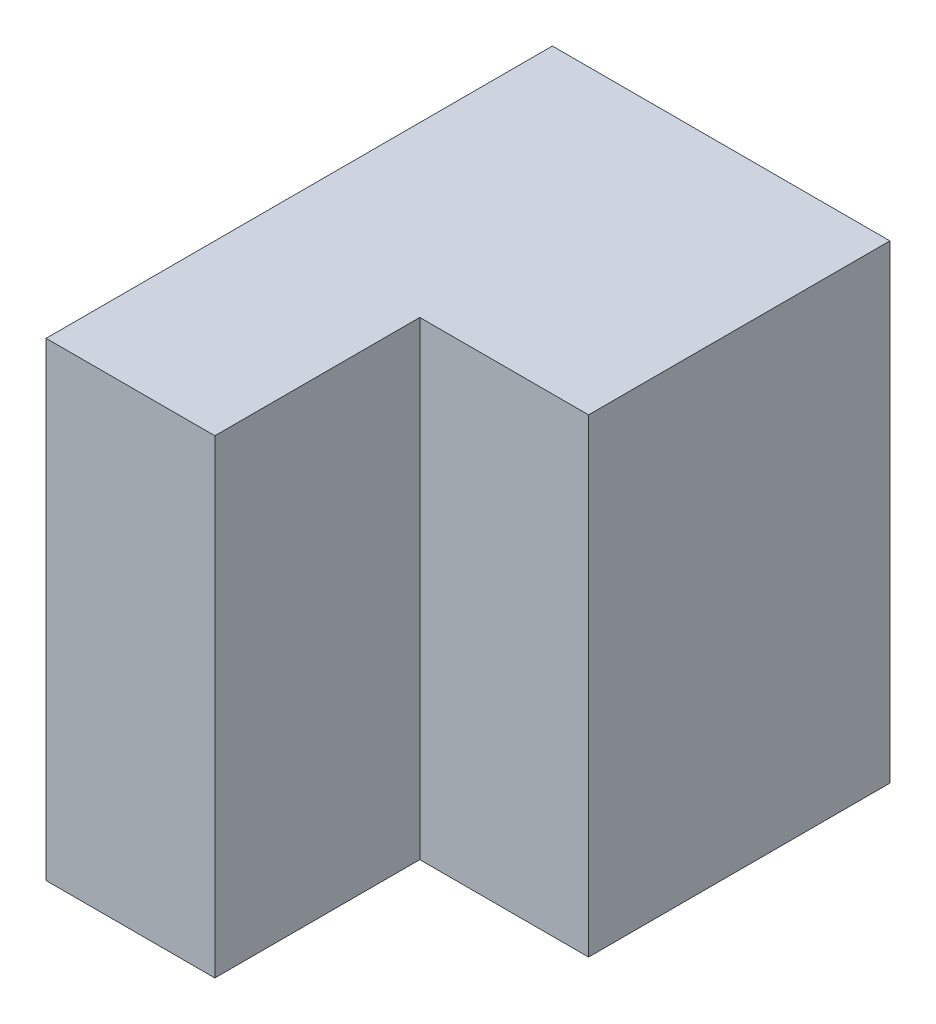
ISO-10303-21;
HEADER;
FILE_DESCRIPTION(('STEP AP214'),'2;1');
FILE_NAME('part.step','',(''),(''),'','','');
FILE_SCHEMA(('AUTOMOTIVE_DESIGN { 1 0 10303 214 1 1 1 1 }'));
ENDSEC;
DATA;
#1=APPLICATION_CONTEXT('core data for automotive mechanical design processes');
#2=APPLICATION_PROTOCOL_DEFINITION('international standard','automotive_design',2000,#1);
#3=PRODUCT_CONTEXT('',#1,'mechanical');
#4=PRODUCT('Part','Part','',(#3));
#5=PRODUCT_RELATED_PRODUCT_CATEGORY('part','',(#4));
#6=PRODUCT_DEFINITION_FORMATION('','',#4);
#7=PRODUCT_DEFINITION_CONTEXT('part definition',#1,'design');
#8=PRODUCT_DEFINITION('design','',#6,#7);
#9=PRODUCT_DEFINITION_SHAPE('','',#8);
#10=(LENGTH_UNIT() NAMED_UNIT(*) SI_UNIT(.MILLI.,.METRE.));
#11=(NAMED_UNIT(*) PLANE_ANGLE_UNIT() SI_UNIT($,.RADIAN.));
#12=(NAMED_UNIT(*) SI_UNIT($,.STERADIAN.) SOLID_ANGLE_UNIT());
#13=UNCERTAINTY_MEASURE_WITH_UNIT(LENGTH_MEASURE(1.E-05),#10,'distance_accuracy_value','');
#14=(GEOMETRIC_REPRESENTATION_CONTEXT(3) GLOBAL_UNCERTAINTY_ASSIGNED_CONTEXT((#13)) GLOBAL_UNIT_ASSIGNED_CONTEXT((#10,
#11,#12)) REPRESENTATION_CONTEXT('',''));
#15=CARTESIAN_POINT('',(0.,0.,0.));
#16=DIRECTION('',(0.,0.,1.));
#17=DIRECTION('',(1.,0.,0.));
#18=AXIS2_PLACEMENT_3D('',#15,#16,#17);
#19=CARTESIAN_POINT('',(10.,0.,0.));
#20=DIRECTION('',(0.,0.,-1.));
#21=DIRECTION('',(-1.,0.,0.));
#22=AXIS2_PLACEMENT_3D('',#19,#20,#21);
#23=PLANE('',#22);
#24=DIRECTION('',(0.,-1.,0.));
#25=VECTOR('',#24,1.);
#26=CARTESIAN_POINT('',(5.,13.9128959378809,0.));
#27=LINE('',#26,#25);
#28=CARTESIAN_POINT('',(5.,13.9128959378809,0.));
#29=VERTEX_POINT('',#28);
#30=CARTESIAN_POINT('',(5.,0.,0.));
#31=VERTEX_POINT('',#30);
#32=EDGE_CURVE('E87',#29,#31,#27,.T.);
#33=ORIENTED_EDGE('',*,*,#32,.F.);
#34=DIRECTION('',(-1.,0.,0.));
#35=VECTOR('',#34,1.);
#36=CARTESIAN_POINT('',(10.,13.9128959378809,0.));
#37=LINE('',#36,#35);
#38=CARTESIAN_POINT('',(0.,13.9128959378809,0.));
#39=VERTEX_POINT('',#38);
#40=EDGE_CURVE('E81',#29,#39,#37,.T.);
#41=ORIENTED_EDGE('',*,*,#40,.T.);
#42=DIRECTION('',(0.,-1.,0.));
#43=VECTOR('',#42,1.);
#44=CARTESIAN_POINT('',(0.,0.,0.));
#45=LINE('',#44,#43);
#46=CARTESIAN_POINT('',(0.,0.,0.));
#47=VERTEX_POINT('',#46);
#48=EDGE_CURVE('E85',#39,#47,#45,.T.);
#49=ORIENTED_EDGE('',*,*,#48,.T.);
#50=DIRECTION('',(-1.,0.,0.));
#51=VECTOR('',#50,1.);
#52=CARTESIAN_POINT('',(10.,0.,0.));
#53=LINE('',#52,#51);
#54=EDGE_CURVE('E11',#31,#47,#53,.T.);
#55=ORIENTED_EDGE('',*,*,#54,.F.);
#56=EDGE_LOOP('',(#33,#41,#49,#55));
#57=FACE_BOUND('',#56,.T.);
#58=ADVANCED_FACE('F39',(#57),#23,.F.);
#59=CARTESIAN_POINT('',(10.,0.,0.));
#60=DIRECTION('',(0.,1.,0.));
#61=DIRECTION('',(0.,0.,1.));
#62=AXIS2_PLACEMENT_3D('',#59,#60,#61);
#63=PLANE('',#62);
#64=DIRECTION('',(0.,0.,-1.));
#65=VECTOR('',#64,1.);
#66=CARTESIAN_POINT('',(10.,0.,0.));
#67=LINE('',#66,#65);
#68=CARTESIAN_POINT('',(10.,0.,-6.07163105874278));
#69=VERTEX_POINT('',#68);
#70=CARTESIAN_POINT('',(10.,0.,-15.));
#71=VERTEX_POINT('',#70);
#72=EDGE_CURVE('E100',#69,#71,#67,.T.);
#73=ORIENTED_EDGE('',*,*,#72,.F.);
#74=DIRECTION('',(1.,0.,0.));
#75=VECTOR('',#74,1.);
#76=CARTESIAN_POINT('',(5.,0.,-6.07163105874278));
#77=LINE('',#76,#75);
#78=CARTESIAN_POINT('',(5.,0.,-6.07163105874278));
#79=VERTEX_POINT('',#78);
#80=EDGE_CURVE('E53',#79,#69,#77,.T.);
#81=ORIENTED_EDGE('',*,*,#80,.F.);
#82=DIRECTION('',(0.,0.,-1.));
#83=VECTOR('',#82,1.);
#84=CARTESIAN_POINT('',(5.,0.,0.));
#85=LINE('',#84,#83);
#86=EDGE_CURVE('E125',#31,#79,#85,.T.);
#87=ORIENTED_EDGE('',*,*,#86,.F.);
#88=ORIENTED_EDGE('',*,*,#54,.T.);
#89=DIRECTION('',(0.,0.,-1.));
#90=VECTOR('',#89,1.);
#91=CARTESIAN_POINT('',(0.,0.,0.));
#92=LINE('',#91,#90);
#93=CARTESIAN_POINT('',(0.,0.,-15.));
#94=VERTEX_POINT('',#93);
#95=EDGE_CURVE('E105',#47,#94,#92,.T.);
#96=ORIENTED_EDGE('',*,*,#95,.T.);
#97=DIRECTION('',(-1.,0.,0.));
#98=VECTOR('',#97,1.);
#99=CARTESIAN_POINT('',(10.,0.,-15.));
#100=LINE('',#99,#98);
#101=EDGE_CURVE('E46',#71,#94,#100,.T.);
#102=ORIENTED_EDGE('',*,*,#101,.F.);
#103=EDGE_LOOP('',(#73,#81,#87,#88,#96,#102));
#104=FACE_BOUND('',#103,.T.);
#105=ADVANCED_FACE('F121',(#104),#63,.F.);
#106=CARTESIAN_POINT('',(10.,0.,-15.));
#107=DIRECTION('',(0.,0.,1.));
#108=DIRECTION('',(1.,0.,0.));
#109=AXIS2_PLACEMENT_3D('',#106,#107,#108);
#110=PLANE('',#109);
#111=DIRECTION('',(0.,1.,0.));
#112=VECTOR('',#111,1.);
#113=CARTESIAN_POINT('',(0.,0.,-15.));
#114=LINE('',#113,#112);
#115=CARTESIAN_POINT('',(0.,13.9128959378809,-15.));
#116=VERTEX_POINT('',#115);
#117=EDGE_CURVE('E101',#94,#116,#114,.T.);
#118=ORIENTED_EDGE('',*,*,#117,.T.);
#119=DIRECTION('',(-1.,0.,0.));
#120=VECTOR('',#119,1.);
#121=CARTESIAN_POINT('',(10.,13.9128959378809,-15.));
#122=LINE('',#121,#120);
#123=CARTESIAN_POINT('',(10.,13.9128959378809,-15.));
#124=VERTEX_POINT('',#123);
#125=EDGE_CURVE('E90',#124,#116,#122,.T.);
#126=ORIENTED_EDGE('',*,*,#125,.F.);
#127=DIRECTION('',(0.,1.,0.));
#128=VECTOR('',#127,1.);
#129=CARTESIAN_POINT('',(10.,0.,-15.));
#130=LINE('',#129,#128);
#131=EDGE_CURVE('E62',#71,#124,#130,.T.);
#132=ORIENTED_EDGE('',*,*,#131,.F.);
#133=ORIENTED_EDGE('',*,*,#101,.T.);
#134=EDGE_LOOP('',(#118,#126,#132,#133));
#135=FACE_BOUND('',#134,.T.);
#136=ADVANCED_FACE('F118',(#135),#110,.F.);
#137=CARTESIAN_POINT('',(10.,13.9128959378809,0.));
#138=DIRECTION('',(0.,-1.,0.));
#139=DIRECTION('',(0.,0.,-1.));
#140=AXIS2_PLACEMENT_3D('',#137,#138,#139);
#141=PLANE('',#140);
#142=DIRECTION('',(0.,0.,1.));
#143=VECTOR('',#142,1.);
#144=CARTESIAN_POINT('',(5.,13.9128959378809,0.));
#145=LINE('',#144,#143);
#146=CARTESIAN_POINT('',(5.,13.9128959378809,-6.07163105874278));
#147=VERTEX_POINT('',#146);
#148=EDGE_CURVE('E137',#147,#29,#145,.T.);
#149=ORIENTED_EDGE('',*,*,#148,.F.);
#150=DIRECTION('',(1.,0.,0.));
#151=VECTOR('',#150,1.);
#152=CARTESIAN_POINT('',(5.,13.9128959378809,-6.07163105874278));
#153=LINE('',#152,#151);
#154=CARTESIAN_POINT('',(10.,13.9128959378809,-6.07163105874278));
#155=VERTEX_POINT('',#154);
#156=EDGE_CURVE('E106',#147,#155,#153,.T.);
#157=ORIENTED_EDGE('',*,*,#156,.T.);
#158=DIRECTION('',(0.,0.,1.));
#159=VECTOR('',#158,1.);
#160=CARTESIAN_POINT('',(10.,13.9128959378809,0.));
#161=LINE('',#160,#159);
#162=EDGE_CURVE('E91',#124,#155,#161,.T.);
#163=ORIENTED_EDGE('',*,*,#162,.F.);
#164=ORIENTED_EDGE('',*,*,#125,.T.);
#165=DIRECTION('',(0.,0.,1.));
#166=VECTOR('',#165,1.);
#167=CARTESIAN_POINT('',(0.,13.9128959378809,0.));
#168=LINE('',#167,#166);
#169=EDGE_CURVE('E95',#116,#39,#168,.T.);
#170=ORIENTED_EDGE('',*,*,#169,.T.);
#171=ORIENTED_EDGE('',*,*,#40,.F.);
#172=EDGE_LOOP('',(#149,#157,#163,#164,#170,#171));
#173=FACE_BOUND('',#172,.T.);
#174=ADVANCED_FACE('F96',(#173),#141,.F.);
#175=CARTESIAN_POINT('',(10.,0.,0.));
#176=DIRECTION('',(-1.,0.,0.));
#177=DIRECTION('',(0.,0.,1.));
#178=AXIS2_PLACEMENT_3D('',#175,#176,#177);
#179=PLANE('',#178);
#180=ORIENTED_EDGE('',*,*,#162,.T.);
#181=DIRECTION('',(0.,1.,0.));
#182=VECTOR('',#181,1.);
#183=CARTESIAN_POINT('',(10.,13.9128959378809,-6.07163105874278));
#184=LINE('',#183,#182);
#185=EDGE_CURVE('E145',#69,#155,#184,.T.);
#186=ORIENTED_EDGE('',*,*,#185,.F.);
#187=ORIENTED_EDGE('',*,*,#72,.T.);
#188=ORIENTED_EDGE('',*,*,#131,.T.);
#189=EDGE_LOOP('',(#180,#186,#187,#188));
#190=FACE_BOUND('',#189,.T.);
#191=ADVANCED_FACE('F147',(#190),#179,.F.);
#192=CARTESIAN_POINT('',(0.,0.,0.));
#193=DIRECTION('',(-1.,0.,0.));
#194=DIRECTION('',(0.,0.,1.));
#195=AXIS2_PLACEMENT_3D('',#192,#193,#194);
#196=PLANE('',#195);
#197=ORIENTED_EDGE('',*,*,#48,.F.);
#198=ORIENTED_EDGE('',*,*,#169,.F.);
#199=ORIENTED_EDGE('',*,*,#117,.F.);
#200=ORIENTED_EDGE('',*,*,#95,.F.);
#201=EDGE_LOOP('',(#197,#198,#199,#200));
#202=FACE_BOUND('',#201,.T.);
#203=ADVANCED_FACE('F104',(#202),#196,.T.);
#204=CARTESIAN_POINT('',(5.,13.9128959378809,-6.07163105874278));
#205=DIRECTION('',(0.,0.,-1.));
#206=DIRECTION('',(0.,1.,0.));
#207=AXIS2_PLACEMENT_3D('',#204,#205,#206);
#208=PLANE('',#207);
#209=ORIENTED_EDGE('',*,*,#185,.T.);
#210=ORIENTED_EDGE('',*,*,#156,.F.);
#211=DIRECTION('',(0.,1.,0.));
#212=VECTOR('',#211,1.);
#213=CARTESIAN_POINT('',(5.,13.9128959378809,-6.07163105874278));
#214=LINE('',#213,#212);
#215=EDGE_CURVE('E139',#79,#147,#214,.T.);
#216=ORIENTED_EDGE('',*,*,#215,.F.);
#217=ORIENTED_EDGE('',*,*,#80,.T.);
#218=EDGE_LOOP('',(#209,#210,#216,#217));
#219=FACE_BOUND('',#218,.T.);
#220=ADVANCED_FACE('F148',(#219),#208,.F.);
#221=CARTESIAN_POINT('',(5.,0.,0.));
#222=DIRECTION('',(1.,0.,0.));
#223=DIRECTION('',(0.,0.,-1.));
#224=AXIS2_PLACEMENT_3D('',#221,#222,#223);
#225=PLANE('',#224);
#226=ORIENTED_EDGE('',*,*,#32,.T.);
#227=ORIENTED_EDGE('',*,*,#86,.T.);
#228=ORIENTED_EDGE('',*,*,#215,.T.);
#229=ORIENTED_EDGE('',*,*,#148,.T.);
#230=EDGE_LOOP('',(#226,#227,#228,#229));
#231=FACE_BOUND('',#230,.T.);
#232=ADVANCED_FACE('F138',(#231),#225,.T.);
#233=CLOSED_SHELL('',(#58,#105,#136,#174,#191,#203,#220,#232));
#234=MANIFOLD_SOLID_BREP('B2',#233);
#235=ADVANCED_BREP_SHAPE_REPRESENTATION('',(#18,#234),#14);
#236=SHAPE_DEFINITION_REPRESENTATION(#9,#235);
ENDSEC;
END-ISO-10303-21;
